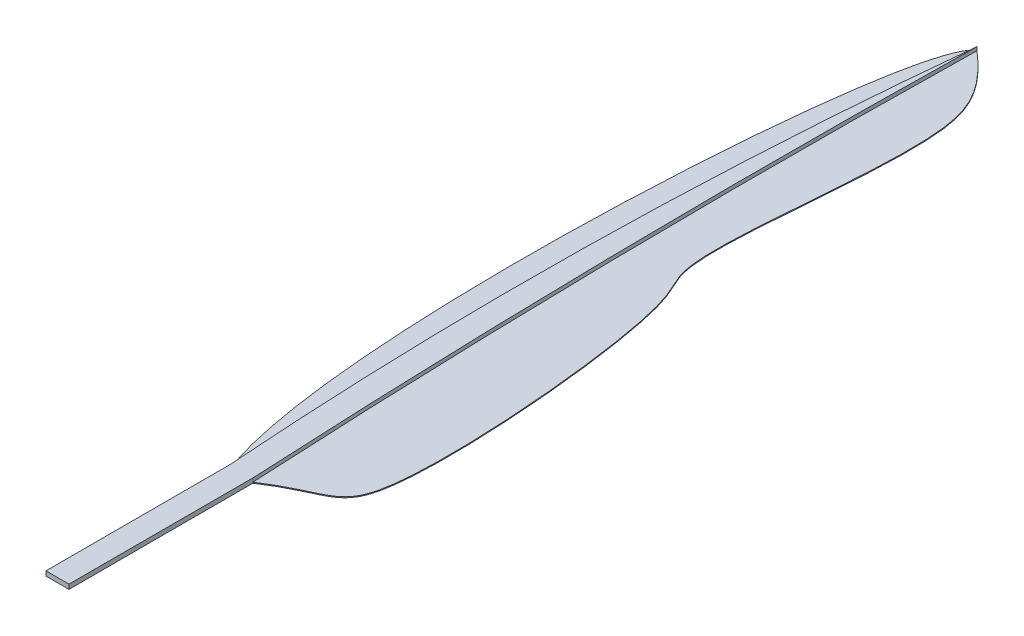
ISO-10303-21;
HEADER;
FILE_DESCRIPTION(('STEP AP214'),'2;1');
FILE_NAME('part.step','',(''),(''),'','','');
FILE_SCHEMA(('AUTOMOTIVE_DESIGN { 1 0 10303 214 1 1 1 1 }'));
ENDSEC;
DATA;
#1=APPLICATION_CONTEXT('core data for automotive mechanical design processes');
#2=APPLICATION_PROTOCOL_DEFINITION('international standard','automotive_design',2000,#1);
#3=PRODUCT_CONTEXT('',#1,'mechanical');
#4=PRODUCT('Part','Part','',(#3));
#5=PRODUCT_RELATED_PRODUCT_CATEGORY('part','',(#4));
#6=PRODUCT_DEFINITION_FORMATION('','',#4);
#7=PRODUCT_DEFINITION_CONTEXT('part definition',#1,'design');
#8=PRODUCT_DEFINITION('design','',#6,#7);
#9=PRODUCT_DEFINITION_SHAPE('','',#8);
#10=(LENGTH_UNIT() NAMED_UNIT(*) SI_UNIT(.MILLI.,.METRE.));
#11=(NAMED_UNIT(*) PLANE_ANGLE_UNIT() SI_UNIT($,.RADIAN.));
#12=(NAMED_UNIT(*) SI_UNIT($,.STERADIAN.) SOLID_ANGLE_UNIT());
#13=UNCERTAINTY_MEASURE_WITH_UNIT(LENGTH_MEASURE(1.E-05),#10,'distance_accuracy_value','');
#14=(GEOMETRIC_REPRESENTATION_CONTEXT(3) GLOBAL_UNCERTAINTY_ASSIGNED_CONTEXT((#13)) GLOBAL_UNIT_ASSIGNED_CONTEXT((#10,
#11,#12)) REPRESENTATION_CONTEXT('',''));
#15=CARTESIAN_POINT('',(0.,0.,0.));
#16=DIRECTION('',(0.,0.,1.));
#17=DIRECTION('',(1.,0.,0.));
#18=AXIS2_PLACEMENT_3D('',#15,#16,#17);
#19=CARTESIAN_POINT('',(-2.5,1.,0.));
#20=CARTESIAN_POINT('',(-8.33151031217227,1.,-79.885222780422));
#21=CARTESIAN_POINT('',(0.,1.,-160.));
#22=B_SPLINE_CURVE_WITH_KNOTS('',2,(#19,#20,#21),.UNSPECIFIED.,.F.,.F.,(3,3),(0.,1.),.UNSPECIFIED.);
#23=DIRECTION('',(0.,-1.,0.));
#24=VECTOR('',#23,1.);
#25=SURFACE_OF_LINEAR_EXTRUSION('',#22,#24);
#26=CARTESIAN_POINT('',(-2.5,0.2,0.));
#27=CARTESIAN_POINT('',(-8.33151031217227,0.2,-79.885222780422));
#28=CARTESIAN_POINT('',(0.,0.2,-160.));
#29=B_SPLINE_CURVE_WITH_KNOTS('',2,(#26,#27,#28),.UNSPECIFIED.,.F.,.F.,(3,3),(0.,1.),.UNSPECIFIED.);
#30=CARTESIAN_POINT('',(-2.5,0.2,0.));
#31=VERTEX_POINT('',#30);
#32=CARTESIAN_POINT('',(-1.25815990044484E-13,0.2,-160.));
#33=VERTEX_POINT('',#32);
#34=EDGE_CURVE('E96',#31,#33,#29,.T.);
#35=ORIENTED_EDGE('',*,*,#34,.F.);
#36=DIRECTION('',(0.,-1.,0.));
#37=VECTOR('',#36,1.);
#38=CARTESIAN_POINT('',(-2.5,1.,0.));
#39=LINE('',#38,#37);
#40=CARTESIAN_POINT('',(-2.5,1.,0.));
#41=VERTEX_POINT('',#40);
#42=EDGE_CURVE('E12',#41,#31,#39,.T.);
#43=ORIENTED_EDGE('',*,*,#42,.F.);
#44=CARTESIAN_POINT('',(-1.25815990044484E-13,1.,-160.));
#45=VERTEX_POINT('',#44);
#46=EDGE_CURVE('E262',#41,#45,#22,.T.);
#47=ORIENTED_EDGE('',*,*,#46,.T.);
#48=DIRECTION('',(0.,-1.,0.));
#49=VECTOR('',#48,1.);
#50=CARTESIAN_POINT('',(-1.25815990044484E-13,1.,-160.));
#51=LINE('',#50,#49);
#52=EDGE_CURVE('E186',#45,#33,#51,.T.);
#53=ORIENTED_EDGE('',*,*,#52,.T.);
#54=EDGE_LOOP('',(#35,#43,#47,#53));
#55=FACE_BOUND('',#54,.T.);
#56=ADVANCED_FACE('F78',(#55),#25,.T.);
#57=CARTESIAN_POINT('',(-2.5,1.,0.));
#58=DIRECTION('',(1.,0.,0.));
#59=DIRECTION('',(0.,0.,-1.));
#60=AXIS2_PLACEMENT_3D('',#57,#58,#59);
#61=PLANE('',#60);
#62=DIRECTION('',(0.,0.,1.));
#63=VECTOR('',#62,1.);
#64=CARTESIAN_POINT('',(-2.5,0.,0.));
#65=LINE('',#64,#63);
#66=CARTESIAN_POINT('',(-2.5,0.,0.));
#67=VERTEX_POINT('',#66);
#68=CARTESIAN_POINT('',(-2.5,0.,40.));
#69=VERTEX_POINT('',#68);
#70=EDGE_CURVE('E155',#67,#69,#65,.T.);
#71=ORIENTED_EDGE('',*,*,#70,.T.);
#72=DIRECTION('',(0.,-1.,0.));
#73=VECTOR('',#72,1.);
#74=CARTESIAN_POINT('',(-2.5,1.,40.));
#75=LINE('',#74,#73);
#76=CARTESIAN_POINT('',(-2.5,1.,40.));
#77=VERTEX_POINT('',#76);
#78=EDGE_CURVE('E88',#77,#69,#75,.T.);
#79=ORIENTED_EDGE('',*,*,#78,.F.);
#80=DIRECTION('',(0.,0.,1.));
#81=VECTOR('',#80,1.);
#82=CARTESIAN_POINT('',(-2.5,1.,0.));
#83=LINE('',#82,#81);
#84=EDGE_CURVE('E265',#41,#77,#83,.T.);
#85=ORIENTED_EDGE('',*,*,#84,.F.);
#86=ORIENTED_EDGE('',*,*,#42,.T.);
#87=DIRECTION('',(0.,-1.,0.));
#88=VECTOR('',#87,1.);
#89=CARTESIAN_POINT('',(-2.5,0.2,0.));
#90=LINE('',#89,#88);
#91=EDGE_CURVE('E159',#31,#67,#90,.T.);
#92=ORIENTED_EDGE('',*,*,#91,.T.);
#93=EDGE_LOOP('',(#71,#79,#85,#86,#92));
#94=FACE_BOUND('',#93,.T.);
#95=ADVANCED_FACE('F280',(#94),#61,.F.);
#96=CARTESIAN_POINT('',(0.,1.,40.));
#97=DIRECTION('',(0.,0.,-1.));
#98=DIRECTION('',(-1.,0.,0.));
#99=AXIS2_PLACEMENT_3D('',#96,#97,#98);
#100=PLANE('',#99);
#101=DIRECTION('',(1.,0.,0.));
#102=VECTOR('',#101,1.);
#103=CARTESIAN_POINT('',(0.,0.,40.));
#104=LINE('',#103,#102);
#105=CARTESIAN_POINT('',(2.5,0.,40.));
#106=VERTEX_POINT('',#105);
#107=EDGE_CURVE('E258',#69,#106,#104,.T.);
#108=ORIENTED_EDGE('',*,*,#107,.T.);
#109=DIRECTION('',(0.,-1.,0.));
#110=VECTOR('',#109,1.);
#111=CARTESIAN_POINT('',(2.5,1.,40.));
#112=LINE('',#111,#110);
#113=CARTESIAN_POINT('',(2.5,1.,40.));
#114=VERTEX_POINT('',#113);
#115=EDGE_CURVE('E198',#114,#106,#112,.T.);
#116=ORIENTED_EDGE('',*,*,#115,.F.);
#117=DIRECTION('',(1.,0.,0.));
#118=VECTOR('',#117,1.);
#119=CARTESIAN_POINT('',(0.,1.,40.));
#120=LINE('',#119,#118);
#121=EDGE_CURVE('E268',#77,#114,#120,.T.);
#122=ORIENTED_EDGE('',*,*,#121,.F.);
#123=ORIENTED_EDGE('',*,*,#78,.T.);
#124=EDGE_LOOP('',(#108,#116,#122,#123));
#125=FACE_BOUND('',#124,.T.);
#126=ADVANCED_FACE('F284',(#125),#100,.F.);
#127=CARTESIAN_POINT('',(2.5,1.,0.));
#128=DIRECTION('',(1.,0.,0.));
#129=DIRECTION('',(0.,0.,-1.));
#130=AXIS2_PLACEMENT_3D('',#127,#128,#129);
#131=PLANE('',#130);
#132=DIRECTION('',(0.,0.,1.));
#133=VECTOR('',#132,1.);
#134=CARTESIAN_POINT('',(2.5,0.,0.));
#135=LINE('',#134,#133);
#136=CARTESIAN_POINT('',(2.5,0.,0.));
#137=VERTEX_POINT('',#136);
#138=EDGE_CURVE('E195',#137,#106,#135,.T.);
#139=ORIENTED_EDGE('',*,*,#138,.F.);
#140=DIRECTION('',(0.,-1.,0.));
#141=VECTOR('',#140,1.);
#142=CARTESIAN_POINT('',(2.5,0.2,0.));
#143=LINE('',#142,#141);
#144=CARTESIAN_POINT('',(2.5,0.2,0.));
#145=VERTEX_POINT('',#144);
#146=EDGE_CURVE('E103',#145,#137,#143,.T.);
#147=ORIENTED_EDGE('',*,*,#146,.F.);
#148=DIRECTION('',(0.,-1.,0.));
#149=VECTOR('',#148,1.);
#150=CARTESIAN_POINT('',(2.5,1.,0.));
#151=LINE('',#150,#149);
#152=CARTESIAN_POINT('',(2.5,1.,0.));
#153=VERTEX_POINT('',#152);
#154=EDGE_CURVE('E190',#153,#145,#151,.T.);
#155=ORIENTED_EDGE('',*,*,#154,.F.);
#156=DIRECTION('',(0.,0.,1.));
#157=VECTOR('',#156,1.);
#158=CARTESIAN_POINT('',(2.5,1.,0.));
#159=LINE('',#158,#157);
#160=EDGE_CURVE('E252',#153,#114,#159,.T.);
#161=ORIENTED_EDGE('',*,*,#160,.T.);
#162=ORIENTED_EDGE('',*,*,#115,.T.);
#163=EDGE_LOOP('',(#139,#147,#155,#161,#162));
#164=FACE_BOUND('',#163,.T.);
#165=ADVANCED_FACE('F244',(#164),#131,.T.);
#166=CARTESIAN_POINT('',(2.5,1.,0.));
#167=CARTESIAN_POINT('',(-1.63918434809833,1.,-79.8301801534041));
#168=CARTESIAN_POINT('',(0.,1.,-160.));
#169=B_SPLINE_CURVE_WITH_KNOTS('',2,(#166,#167,#168),.UNSPECIFIED.,.F.,.F.,(3,3),(0.,1.),.UNSPECIFIED.);
#170=DIRECTION('',(0.,-1.,0.));
#171=VECTOR('',#170,1.);
#172=SURFACE_OF_LINEAR_EXTRUSION('',#169,#171);
#173=ORIENTED_EDGE('',*,*,#154,.T.);
#174=CARTESIAN_POINT('',(2.5,0.2,0.));
#175=CARTESIAN_POINT('',(-1.63918434809833,0.2,-79.8301801534041));
#176=CARTESIAN_POINT('',(0.,0.2,-160.));
#177=B_SPLINE_CURVE_WITH_KNOTS('',2,(#174,#175,#176),.UNSPECIFIED.,.F.,.F.,(3,3),(0.,1.),.UNSPECIFIED.);
#178=EDGE_CURVE('E147',#145,#33,#177,.T.);
#179=ORIENTED_EDGE('',*,*,#178,.T.);
#180=ORIENTED_EDGE('',*,*,#52,.F.);
#181=EDGE_CURVE('E191',#153,#45,#169,.T.);
#182=ORIENTED_EDGE('',*,*,#181,.F.);
#183=EDGE_LOOP('',(#173,#179,#180,#182));
#184=FACE_BOUND('',#183,.T.);
#185=ADVANCED_FACE('F208',(#184),#172,.F.);
#186=CARTESIAN_POINT('',(0.,1.,0.));
#187=DIRECTION('',(0.,1.,0.));
#188=DIRECTION('',(0.,0.,1.));
#189=AXIS2_PLACEMENT_3D('',#186,#187,#188);
#190=PLANE('',#189);
#191=ORIENTED_EDGE('',*,*,#46,.F.);
#192=ORIENTED_EDGE('',*,*,#84,.T.);
#193=ORIENTED_EDGE('',*,*,#121,.T.);
#194=ORIENTED_EDGE('',*,*,#160,.F.);
#195=ORIENTED_EDGE('',*,*,#181,.T.);
#196=EDGE_LOOP('',(#191,#192,#193,#194,#195));
#197=FACE_BOUND('',#196,.T.);
#198=ADVANCED_FACE('F235',(#197),#190,.T.);
#199=CARTESIAN_POINT('',(0.,0.,0.));
#200=DIRECTION('',(0.,1.,0.));
#201=DIRECTION('',(0.,0.,1.));
#202=AXIS2_PLACEMENT_3D('',#199,#200,#201);
#203=PLANE('',#202);
#204=ORIENTED_EDGE('',*,*,#70,.F.);
#205=CARTESIAN_POINT('',(0.,0.,-160.));
#206=CARTESIAN_POINT('',(-8.98258689017864,0.,-157.02809312401));
#207=CARTESIAN_POINT('',(-16.4999849479022,0.,-35.9064792529689));
#208=CARTESIAN_POINT('',(-2.49999999999998,0.,0.));
#209=B_SPLINE_CURVE_WITH_KNOTS('',3,(#205,#206,#207,#208),.UNSPECIFIED.,.F.,.F.,(4,4),(0.,1.),.UNSPECIFIED.);
#210=CARTESIAN_POINT('',(-1.25815990044484E-13,0.,-160.));
#211=VERTEX_POINT('',#210);
#212=EDGE_CURVE('E152',#211,#67,#209,.T.);
#213=ORIENTED_EDGE('',*,*,#212,.F.);
#214=CARTESIAN_POINT('',(2.5,0.,0.));
#215=CARTESIAN_POINT('',(12.1713543824462,0.,-6.46777728335555));
#216=CARTESIAN_POINT('',(22.6994500577667,0.,-1.26161849241688));
#217=CARTESIAN_POINT('',(16.0201818832463,0.,-76.7764523493711));
#218=CARTESIAN_POINT('',(5.94399475673193,0.,-89.5578868925568));
#219=CARTESIAN_POINT('',(14.6334186310399,0.,-135.720154628198));
#220=CARTESIAN_POINT('',(8.58522493759972,0.,-152.595946760903));
#221=CARTESIAN_POINT('',(-1.25815990044484E-13,0.,-160.));
#222=B_SPLINE_CURVE_WITH_KNOTS('',3,(#214,#215,#216,#217,#218,#219,#220,#221),.UNSPECIFIED.,.F.,
.F.,(4,1,1,1,1,4),(0.,0.195491685547075,0.494280015241678,0.568689677087913,0.86517864216319,
1.),.UNSPECIFIED.);
#223=EDGE_CURVE('E137',#137,#211,#222,.T.);
#224=ORIENTED_EDGE('',*,*,#223,.F.);
#225=ORIENTED_EDGE('',*,*,#138,.T.);
#226=ORIENTED_EDGE('',*,*,#107,.F.);
#227=EDGE_LOOP('',(#204,#213,#224,#225,#226));
#228=FACE_BOUND('',#227,.T.);
#229=ADVANCED_FACE('F153',(#228),#203,.F.);
#230=CARTESIAN_POINT('',(2.5,0.2,0.));
#231=CARTESIAN_POINT('',(12.1713543824462,0.2,-6.46777728335555));
#232=CARTESIAN_POINT('',(22.6994500577667,0.2,-1.26161849241688));
#233=CARTESIAN_POINT('',(16.0201818832463,0.2,-76.7764523493711));
#234=CARTESIAN_POINT('',(5.94399475673193,0.2,-89.5578868925568));
#235=CARTESIAN_POINT('',(14.6334186310399,0.2,-135.720154628198));
#236=CARTESIAN_POINT('',(8.58522493759972,0.2,-152.595946760903));
#237=CARTESIAN_POINT('',(-1.25815990044484E-13,0.2,-160.));
#238=B_SPLINE_CURVE_WITH_KNOTS('',3,(#230,#231,#232,#233,#234,#235,#236,#237),.UNSPECIFIED.,.F.,
.F.,(4,1,1,1,1,4),(0.,0.195491685547075,0.494280015241678,0.568689677087913,0.86517864216319,
1.),.UNSPECIFIED.);
#239=DIRECTION('',(0.,-1.,0.));
#240=VECTOR('',#239,1.);
#241=SURFACE_OF_LINEAR_EXTRUSION('',#238,#240);
#242=ORIENTED_EDGE('',*,*,#223,.T.);
#243=DIRECTION('',(0.,-1.,0.));
#244=VECTOR('',#243,1.);
#245=CARTESIAN_POINT('',(-1.25815990044484E-13,0.2,-160.));
#246=LINE('',#245,#244);
#247=EDGE_CURVE('E142',#33,#211,#246,.T.);
#248=ORIENTED_EDGE('',*,*,#247,.F.);
#249=EDGE_CURVE('E164',#145,#33,#238,.T.);
#250=ORIENTED_EDGE('',*,*,#249,.F.);
#251=ORIENTED_EDGE('',*,*,#146,.T.);
#252=EDGE_LOOP('',(#242,#248,#250,#251));
#253=FACE_BOUND('',#252,.T.);
#254=ADVANCED_FACE('F139',(#253),#241,.F.);
#255=CARTESIAN_POINT('',(0.,0.2,0.));
#256=DIRECTION('',(0.,1.,0.));
#257=DIRECTION('',(0.,0.,1.));
#258=AXIS2_PLACEMENT_3D('',#255,#256,#257);
#259=PLANE('',#258);
#260=ORIENTED_EDGE('',*,*,#178,.F.);
#261=ORIENTED_EDGE('',*,*,#249,.T.);
#262=EDGE_LOOP('',(#260,#261));
#263=FACE_BOUND('',#262,.T.);
#264=ADVANCED_FACE('F213',(#263),#259,.T.);
#265=CARTESIAN_POINT('',(0.,0.2,-160.));
#266=CARTESIAN_POINT('',(-8.98258689017864,0.2,-157.02809312401));
#267=CARTESIAN_POINT('',(-16.4999849479022,0.2,-35.9064792529689));
#268=CARTESIAN_POINT('',(-2.49999999999998,0.2,0.));
#269=B_SPLINE_CURVE_WITH_KNOTS('',3,(#265,#266,#267,#268),.UNSPECIFIED.,.F.,.F.,(4,4),(0.,1.),.UNSPECIFIED.);
#270=DIRECTION('',(0.,-1.,0.));
#271=VECTOR('',#270,1.);
#272=SURFACE_OF_LINEAR_EXTRUSION('',#269,#271);
#273=ORIENTED_EDGE('',*,*,#212,.T.);
#274=ORIENTED_EDGE('',*,*,#91,.F.);
#275=EDGE_CURVE('E148',#33,#31,#269,.T.);
#276=ORIENTED_EDGE('',*,*,#275,.F.);
#277=ORIENTED_EDGE('',*,*,#247,.T.);
#278=EDGE_LOOP('',(#273,#274,#276,#277));
#279=FACE_BOUND('',#278,.T.);
#280=ADVANCED_FACE('F161',(#279),#272,.F.);
#281=CARTESIAN_POINT('',(0.,0.2,0.));
#282=DIRECTION('',(0.,1.,0.));
#283=DIRECTION('',(0.,0.,1.));
#284=AXIS2_PLACEMENT_3D('',#281,#282,#283);
#285=PLANE('',#284);
#286=ORIENTED_EDGE('',*,*,#34,.T.);
#287=ORIENTED_EDGE('',*,*,#275,.T.);
#288=EDGE_LOOP('',(#286,#287));
#289=FACE_BOUND('',#288,.T.);
#290=ADVANCED_FACE('F303',(#289),#285,.T.);
#291=CLOSED_SHELL('',(#56,#95,#126,#165,#185,#198,#229,#254,#264,#280,#290));
#292=MANIFOLD_SOLID_BREP('B2',#291);
#293=ADVANCED_BREP_SHAPE_REPRESENTATION('',(#18,#292),#14);
#294=SHAPE_DEFINITION_REPRESENTATION(#9,#293);
ENDSEC;
END-ISO-10303-21;
